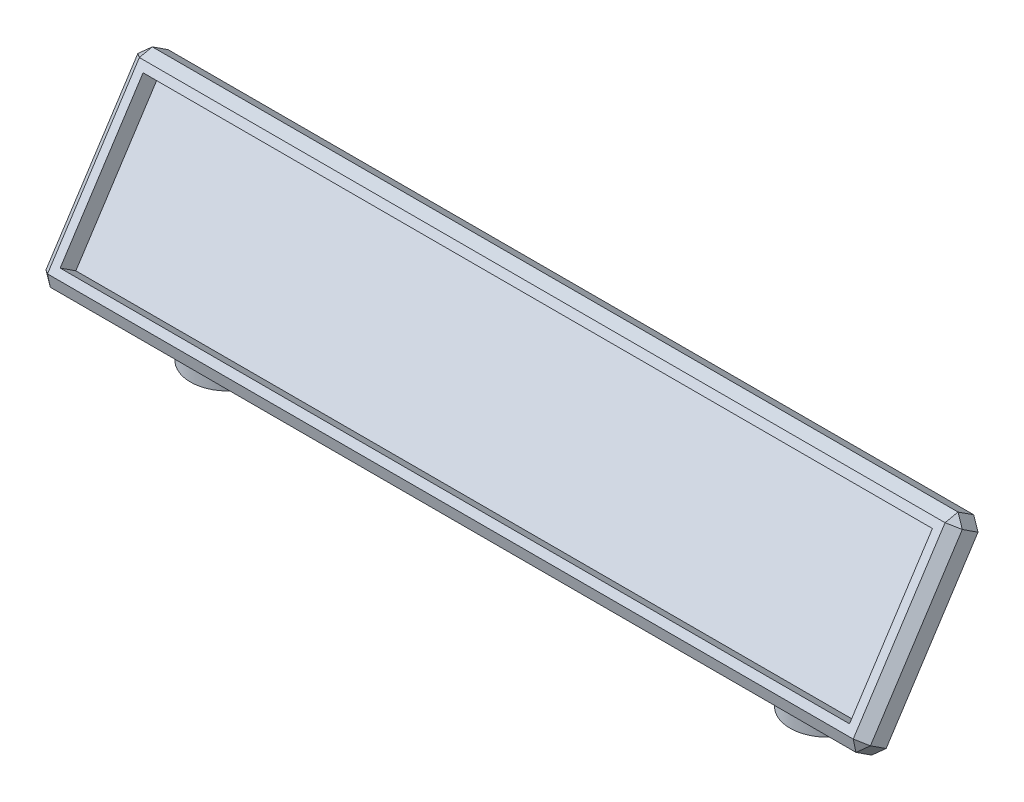
ISO-10303-21;
HEADER;
FILE_DESCRIPTION(('STEP AP214'),'2;1');
FILE_NAME('part.step','',(''),(''),'','','');
FILE_SCHEMA(('AUTOMOTIVE_DESIGN { 1 0 10303 214 1 1 1 1 }'));
ENDSEC;
DATA;
#1=APPLICATION_CONTEXT('core data for automotive mechanical design processes');
#2=APPLICATION_PROTOCOL_DEFINITION('international standard','automotive_design',2000,#1);
#3=PRODUCT_CONTEXT('',#1,'mechanical');
#4=PRODUCT('Part','Part','',(#3));
#5=PRODUCT_RELATED_PRODUCT_CATEGORY('part','',(#4));
#6=PRODUCT_DEFINITION_FORMATION('','',#4);
#7=PRODUCT_DEFINITION_CONTEXT('part definition',#1,'design');
#8=PRODUCT_DEFINITION('design','',#6,#7);
#9=PRODUCT_DEFINITION_SHAPE('','',#8);
#10=(LENGTH_UNIT() NAMED_UNIT(*) SI_UNIT(.MILLI.,.METRE.));
#11=(NAMED_UNIT(*) PLANE_ANGLE_UNIT() SI_UNIT($,.RADIAN.));
#12=(NAMED_UNIT(*) SI_UNIT($,.STERADIAN.) SOLID_ANGLE_UNIT());
#13=UNCERTAINTY_MEASURE_WITH_UNIT(LENGTH_MEASURE(1.E-05),#10,'distance_accuracy_value','');
#14=(GEOMETRIC_REPRESENTATION_CONTEXT(3) GLOBAL_UNCERTAINTY_ASSIGNED_CONTEXT((#13)) GLOBAL_UNIT_ASSIGNED_CONTEXT((#10,
#11,#12)) REPRESENTATION_CONTEXT('',''));
#15=CARTESIAN_POINT('',(0.,0.,0.));
#16=DIRECTION('',(0.,0.,1.));
#17=DIRECTION('',(1.,0.,0.));
#18=AXIS2_PLACEMENT_3D('',#15,#16,#17);
#19=CARTESIAN_POINT('',(0.,5.65083347470303,8.70152048404579));
#20=DIRECTION('',(0.,0.544639035015028,0.838670567945423));
#21=DIRECTION('',(0.,-0.838670567945423,0.544639035015028));
#22=AXIS2_PLACEMENT_3D('',#19,#20,#21);
#23=PLANE('',#22);
#24=DIRECTION('',(-1.,0.,0.));
#25=VECTOR('',#24,1.);
#26=CARTESIAN_POINT('',(-69.85,7.06749426047978,7.78153021277722));
#27=LINE('',#26,#25);
#28=CARTESIAN_POINT('',(68.2625,7.06749426047977,7.78153021277721));
#29=VERTEX_POINT('',#28);
#30=CARTESIAN_POINT('',(-68.2625,7.06749426047978,7.78153021277722));
#31=VERTEX_POINT('',#30);
#32=EDGE_CURVE('E252',#29,#31,#27,.T.);
#33=ORIENTED_EDGE('',*,*,#32,.T.);
#34=DIRECTION('',(0.,0.838670567945423,-0.544639035015028));
#35=VECTOR('',#34,1.);
#36=CARTESIAN_POINT('',(-68.2625,5.65083347470303,8.70152048404579));
#37=LINE('',#36,#35);
#38=CARTESIAN_POINT('',(-68.2625,31.0325057395202,-7.7815302127772));
#39=VERTEX_POINT('',#38);
#40=EDGE_CURVE('E261',#31,#39,#37,.T.);
#41=ORIENTED_EDGE('',*,*,#40,.T.);
#42=DIRECTION('',(1.,0.,0.));
#43=VECTOR('',#42,1.);
#44=CARTESIAN_POINT('',(0.,31.0325057395202,-7.7815302127772));
#45=LINE('',#44,#43);
#46=CARTESIAN_POINT('',(68.2625,31.0325057395202,-7.78153021277721));
#47=VERTEX_POINT('',#46);
#48=EDGE_CURVE('E258',#39,#47,#45,.T.);
#49=ORIENTED_EDGE('',*,*,#48,.T.);
#50=DIRECTION('',(0.,-0.838670567945423,0.544639035015028));
#51=VECTOR('',#50,1.);
#52=CARTESIAN_POINT('',(68.2625,5.73610473386639,8.64614468086358));
#53=LINE('',#52,#51);
#54=EDGE_CURVE('E255',#47,#29,#53,.T.);
#55=ORIENTED_EDGE('',*,*,#54,.T.);
#56=EDGE_LOOP('',(#33,#41,#49,#55));
#57=FACE_BOUND('',#56,.T.);
#58=CARTESIAN_POINT('',(-50.8,19.05,0.));
#59=DIRECTION('',(0.,0.544639035015028,0.838670567945423));
#60=DIRECTION('',(0.,-0.838670567945423,0.544639035015028));
#61=AXIS2_PLACEMENT_3D('',#58,#59,#60);
#62=ELLIPSE('',#61,11.6590982132318,6.35);
#63=CARTESIAN_POINT('',(-50.8,9.27185747977741,6.35000000000002));
#64=VERTEX_POINT('',#63);
#65=EDGE_CURVE('E227',#64,#64,#62,.T.);
#66=ORIENTED_EDGE('',*,*,#65,.T.);
#67=EDGE_LOOP('',(#66));
#68=FACE_BOUND('',#67,.T.);
#69=CARTESIAN_POINT('',(50.8,19.05,0.));
#70=DIRECTION('',(0.,0.544639035015028,0.838670567945423));
#71=DIRECTION('',(0.,-0.838670567945423,0.544639035015028));
#72=AXIS2_PLACEMENT_3D('',#69,#70,#71);
#73=ELLIPSE('',#72,11.6590982132318,6.35);
#74=CARTESIAN_POINT('',(50.8,9.27185747977745,6.34999999999999));
#75=VERTEX_POINT('',#74);
#76=EDGE_CURVE('E235',#75,#75,#73,.F.);
#77=ORIENTED_EDGE('',*,*,#76,.F.);
#78=EDGE_LOOP('',(#77));
#79=FACE_BOUND('',#78,.T.);
#80=ADVANCED_FACE('F49',(#57,#68,#79),#23,.F.);
#81=CARTESIAN_POINT('',(-50.8,19.05,0.));
#82=DIRECTION('',(0.,-1.,0.));
#83=DIRECTION('',(0.,0.,-1.));
#84=AXIS2_PLACEMENT_3D('',#81,#82,#83);
#85=CYLINDRICAL_SURFACE('',#84,6.35);
#86=CARTESIAN_POINT('',(-50.8,0.,0.));
#87=DIRECTION('',(0.,1.,0.));
#88=DIRECTION('',(0.,0.,1.));
#89=AXIS2_PLACEMENT_3D('',#86,#87,#88);
#90=CIRCLE('',#89,6.35);
#91=CARTESIAN_POINT('',(-50.8,0.,6.35000000000002));
#92=VERTEX_POINT('',#91);
#93=EDGE_CURVE('E231',#92,#92,#90,.T.);
#94=ORIENTED_EDGE('',*,*,#93,.T.);
#95=EDGE_LOOP('',(#94));
#96=FACE_BOUND('',#95,.T.);
#97=ORIENTED_EDGE('',*,*,#65,.F.);
#98=EDGE_LOOP('',(#97));
#99=FACE_BOUND('',#98,.T.);
#100=ADVANCED_FACE('F454',(#96,#99),#85,.T.);
#101=CARTESIAN_POINT('',(-50.8,0.,0.));
#102=DIRECTION('',(0.,1.,0.));
#103=DIRECTION('',(0.,0.,1.));
#104=AXIS2_PLACEMENT_3D('',#101,#102,#103);
#105=PLANE('',#104);
#106=CARTESIAN_POINT('',(-50.8,0.,0.));
#107=DIRECTION('',(0.,-1.,0.));
#108=DIRECTION('',(0.,0.,-1.));
#109=AXIS2_PLACEMENT_3D('',#106,#107,#108);
#110=CIRCLE('',#109,3.30200000000001);
#111=CARTESIAN_POINT('',(-50.8,0.,-3.302));
#112=VERTEX_POINT('',#111);
#113=EDGE_CURVE('E1039',#112,#112,#110,.T.);
#114=ORIENTED_EDGE('',*,*,#113,.F.);
#115=EDGE_LOOP('',(#114));
#116=FACE_BOUND('',#115,.T.);
#117=ORIENTED_EDGE('',*,*,#93,.F.);
#118=EDGE_LOOP('',(#117));
#119=FACE_BOUND('',#118,.T.);
#120=ADVANCED_FACE('F460',(#116,#119),#105,.F.);
#121=CARTESIAN_POINT('',(0.,35.822353138479,-3.32058657441013));
#122=DIRECTION('',(0.,-0.838670567945423,0.544639035015028));
#123=DIRECTION('',(0.,-0.544639035015028,-0.838670567945423));
#124=AXIS2_PLACEMENT_3D('',#121,#122,#123);
#125=PLANE('',#124);
#126=DIRECTION('',(0.,-0.544639035015028,-0.838670567945423));
#127=VECTOR('',#126,1.);
#128=CARTESIAN_POINT('',(68.2625,32.3638952661336,-8.64614468086357));
#129=LINE('',#128,#127);
#130=CARTESIAN_POINT('',(68.2625,34.9577386703927,-4.65197610102351));
#131=VERTEX_POINT('',#130);
#132=CARTESIAN_POINT('',(68.2625,33.22850973422,-7.31475515425019));
#133=VERTEX_POINT('',#132);
#134=EDGE_CURVE('E271',#131,#133,#129,.T.);
#135=ORIENTED_EDGE('',*,*,#134,.T.);
#136=DIRECTION('',(-1.,0.,0.));
#137=VECTOR('',#136,1.);
#138=CARTESIAN_POINT('',(0.,33.22850973422,-7.31475515425019));
#139=LINE('',#138,#137);
#140=CARTESIAN_POINT('',(-68.2625,33.22850973422,-7.31475515425018));
#141=VERTEX_POINT('',#140);
#142=EDGE_CURVE('E274',#133,#141,#139,.T.);
#143=ORIENTED_EDGE('',*,*,#142,.T.);
#144=DIRECTION('',(0.,0.544639035015028,0.838670567945423));
#145=VECTOR('',#144,1.);
#146=CARTESIAN_POINT('',(-68.2625,35.822353138479,-3.32058657441013));
#147=LINE('',#146,#145);
#148=CARTESIAN_POINT('',(-68.2625,34.9577386703927,-4.6519761010235));
#149=VERTEX_POINT('',#148);
#150=EDGE_CURVE('E265',#141,#149,#147,.T.);
#151=ORIENTED_EDGE('',*,*,#150,.T.);
#152=DIRECTION('',(1.,0.,0.));
#153=VECTOR('',#152,1.);
#154=CARTESIAN_POINT('',(69.85,34.9577386703927,-4.65197610102351));
#155=LINE('',#154,#153);
#156=EDGE_CURVE('E268',#149,#131,#155,.T.);
#157=ORIENTED_EDGE('',*,*,#156,.T.);
#158=EDGE_LOOP('',(#135,#143,#151,#157));
#159=FACE_BOUND('',#158,.T.);
#160=ADVANCED_FACE('F415',(#159),#125,.F.);
#161=CARTESIAN_POINT('',(-69.85,9.10929134704846,14.0270785904992));
#162=DIRECTION('',(1.,0.,0.));
#163=DIRECTION('',(0.,1.,0.));
#164=AXIS2_PLACEMENT_3D('',#161,#162,#163);
#165=PLANE('',#164);
#166=DIRECTION('',(0.,-0.544639035015028,-0.838670567945423));
#167=VECTOR('',#166,1.);
#168=CARTESIAN_POINT('',(-69.85,34.4909636118657,-2.45597210632377));
#169=LINE('',#168,#167);
#170=CARTESIAN_POINT('',(-69.85,33.6263491437793,-3.78736163293714));
#171=VERTEX_POINT('',#170);
#172=CARTESIAN_POINT('',(-69.85,31.8971202076066,-6.45014068616384));
#173=VERTEX_POINT('',#172);
#174=EDGE_CURVE('E239',#171,#173,#169,.T.);
#175=ORIENTED_EDGE('',*,*,#174,.T.);
#176=DIRECTION('',(0.,-0.838670567945423,0.544639035015028));
#177=VECTOR('',#176,1.);
#178=CARTESIAN_POINT('',(-69.85,6.51544794278939,10.0329100106592));
#179=LINE('',#178,#177);
#180=CARTESIAN_POINT('',(-69.85,7.93210872856614,9.11291973939058));
#181=VERTEX_POINT('',#180);
#182=EDGE_CURVE('E248',#173,#181,#179,.T.);
#183=ORIENTED_EDGE('',*,*,#182,.T.);
#184=DIRECTION('',(0.,0.544639035015028,0.838670567945423));
#185=VECTOR('',#184,1.);
#186=CARTESIAN_POINT('',(-69.85,10.5259521328252,13.1070883192307));
#187=LINE('',#186,#185);
#188=CARTESIAN_POINT('',(-69.85,9.66133766473884,11.7756987926173));
#189=VERTEX_POINT('',#188);
#190=EDGE_CURVE('E245',#181,#189,#187,.T.);
#191=ORIENTED_EDGE('',*,*,#190,.T.);
#192=DIRECTION('',(0.,0.838670567945423,-0.544639035015028));
#193=VECTOR('',#192,1.);
#194=CARTESIAN_POINT('',(-69.85,34.9577386703927,-4.65197610102349));
#195=LINE('',#194,#193);
#196=EDGE_CURVE('E242',#189,#171,#195,.T.);
#197=ORIENTED_EDGE('',*,*,#196,.T.);
#198=EDGE_LOOP('',(#175,#183,#191,#197));
#199=FACE_BOUND('',#198,.T.);
#200=ADVANCED_FACE('F473',(#199),#165,.F.);
#201=CARTESIAN_POINT('',(0.,9.19456260621184,13.971702787317));
#202=DIRECTION('',(0.,-0.838670567945423,0.544639035015028));
#203=DIRECTION('',(0.,-0.544639035015028,-0.838670567945423));
#204=AXIS2_PLACEMENT_3D('',#201,#202,#203);
#205=PLANE('',#204);
#206=DIRECTION('',(-1.,0.,0.));
#207=VECTOR('',#206,1.);
#208=CARTESIAN_POINT('',(0.,8.32994813812548,12.6403132607036));
#209=LINE('',#208,#207);
#210=CARTESIAN_POINT('',(68.2625,8.32994813812547,12.6403132607036));
#211=VERTEX_POINT('',#210);
#212=CARTESIAN_POINT('',(-68.2625,8.32994813812548,12.6403132607036));
#213=VERTEX_POINT('',#212);
#214=EDGE_CURVE('E294',#211,#213,#209,.T.);
#215=ORIENTED_EDGE('',*,*,#214,.T.);
#216=DIRECTION('',(0.,-0.544639035015028,-0.838670567945423));
#217=VECTOR('',#216,1.);
#218=CARTESIAN_POINT('',(-68.2625,5.73610473386641,8.64614468086358));
#219=LINE('',#218,#217);
#220=CARTESIAN_POINT('',(-68.2625,6.60071920195278,9.97753420747695));
#221=VERTEX_POINT('',#220);
#222=EDGE_CURVE('E301',#213,#221,#219,.T.);
#223=ORIENTED_EDGE('',*,*,#222,.T.);
#224=DIRECTION('',(1.,0.,0.));
#225=VECTOR('',#224,1.);
#226=CARTESIAN_POINT('',(69.85,6.60071920195278,9.97753420747695));
#227=LINE('',#226,#225);
#228=CARTESIAN_POINT('',(68.2625,6.60071920195278,9.97753420747695));
#229=VERTEX_POINT('',#228);
#230=EDGE_CURVE('E297',#221,#229,#227,.T.);
#231=ORIENTED_EDGE('',*,*,#230,.T.);
#232=DIRECTION('',(0.,0.544639035015028,0.838670567945423));
#233=VECTOR('',#232,1.);
#234=CARTESIAN_POINT('',(68.2625,9.19456260621184,13.971702787317));
#235=LINE('',#234,#233);
#236=EDGE_CURVE('E291',#229,#211,#235,.T.);
#237=ORIENTED_EDGE('',*,*,#236,.T.);
#238=EDGE_LOOP('',(#215,#223,#231,#237));
#239=FACE_BOUND('',#238,.T.);
#240=ADVANCED_FACE('F437',(#239),#205,.T.);
#241=CARTESIAN_POINT('',(69.85,9.10929134704845,14.0270785904992));
#242=DIRECTION('',(1.,0.,0.));
#243=DIRECTION('',(0.,1.,0.));
#244=AXIS2_PLACEMENT_3D('',#241,#242,#243);
#245=PLANE('',#244);
#246=DIRECTION('',(0.,-0.544639035015028,-0.838670567945423));
#247=VECTOR('',#246,1.);
#248=CARTESIAN_POINT('',(69.85,10.5259521328252,13.1070883192306));
#249=LINE('',#248,#247);
#250=CARTESIAN_POINT('',(69.85,9.66133766473884,11.7756987926173));
#251=VERTEX_POINT('',#250);
#252=CARTESIAN_POINT('',(69.85,7.93210872856614,9.11291973939058));
#253=VERTEX_POINT('',#252);
#254=EDGE_CURVE('E284',#251,#253,#249,.T.);
#255=ORIENTED_EDGE('',*,*,#254,.T.);
#256=DIRECTION('',(0.,0.838670567945423,-0.544639035015028));
#257=VECTOR('',#256,1.);
#258=CARTESIAN_POINT('',(69.85,33.22850973422,-7.31475515425019));
#259=LINE('',#258,#257);
#260=CARTESIAN_POINT('',(69.85,31.8971202076066,-6.45014068616383));
#261=VERTEX_POINT('',#260);
#262=EDGE_CURVE('E287',#253,#261,#259,.T.);
#263=ORIENTED_EDGE('',*,*,#262,.T.);
#264=DIRECTION('',(0.,0.544639035015028,0.838670567945423));
#265=VECTOR('',#264,1.);
#266=CARTESIAN_POINT('',(69.85,34.4909636118657,-2.45597210632377));
#267=LINE('',#266,#265);
#268=CARTESIAN_POINT('',(69.85,33.6263491437793,-3.78736163293714));
#269=VERTEX_POINT('',#268);
#270=EDGE_CURVE('E278',#261,#269,#267,.T.);
#271=ORIENTED_EDGE('',*,*,#270,.T.);
#272=DIRECTION('',(0.,-0.838670567945423,0.544639035015028));
#273=VECTOR('',#272,1.);
#274=CARTESIAN_POINT('',(69.85,8.24467687896209,12.6956890638859));
#275=LINE('',#274,#273);
#276=EDGE_CURVE('E281',#269,#251,#275,.T.);
#277=ORIENTED_EDGE('',*,*,#276,.T.);
#278=EDGE_LOOP('',(#255,#263,#271,#277));
#279=FACE_BOUND('',#278,.T.);
#280=ADVANCED_FACE('F467',(#279),#245,.T.);
#281=CARTESIAN_POINT('',(0.,9.10929134704845,14.0270785904992));
#282=DIRECTION('',(0.,0.544639035015028,0.838670567945423));
#283=DIRECTION('',(0.,-0.838670567945423,0.544639035015028));
#284=AXIS2_PLACEMENT_3D('',#281,#282,#283);
#285=PLANE('',#284);
#286=DIRECTION('',(0.,-0.838670567945423,0.544639035015028));
#287=VECTOR('',#286,1.);
#288=CARTESIAN_POINT('',(-68.2625,9.19456260621184,13.971702787317));
#289=LINE('',#288,#287);
#290=CARTESIAN_POINT('',(-68.2625,34.4909636118657,-2.45597210632377));
#291=VERTEX_POINT('',#290);
#292=CARTESIAN_POINT('',(-68.2625,10.5259521328252,13.1070883192306));
#293=VERTEX_POINT('',#292);
#294=EDGE_CURVE('E60',#291,#293,#289,.T.);
#295=ORIENTED_EDGE('',*,*,#294,.T.);
#296=DIRECTION('',(1.,0.,0.));
#297=VECTOR('',#296,1.);
#298=CARTESIAN_POINT('',(0.,10.5259521328252,13.1070883192306));
#299=LINE('',#298,#297);
#300=CARTESIAN_POINT('',(68.2625,10.5259521328252,13.1070883192306));
#301=VERTEX_POINT('',#300);
#302=EDGE_CURVE('E11',#293,#301,#299,.T.);
#303=ORIENTED_EDGE('',*,*,#302,.T.);
#304=DIRECTION('',(0.,0.838670567945423,-0.544639035015028));
#305=VECTOR('',#304,1.);
#306=CARTESIAN_POINT('',(68.2625,9.10929134704845,14.0270785904992));
#307=LINE('',#306,#305);
#308=CARTESIAN_POINT('',(68.2625,34.4909636118657,-2.45597210632377));
#309=VERTEX_POINT('',#308);
#310=EDGE_CURVE('E307',#301,#309,#307,.T.);
#311=ORIENTED_EDGE('',*,*,#310,.T.);
#312=DIRECTION('',(-1.,0.,0.));
#313=VECTOR('',#312,1.);
#314=CARTESIAN_POINT('',(-69.85,34.4909636118657,-2.45597210632376));
#315=LINE('',#314,#313);
#316=EDGE_CURVE('E304',#309,#291,#315,.T.);
#317=ORIENTED_EDGE('',*,*,#316,.T.);
#318=EDGE_LOOP('',(#295,#303,#311,#317));
#319=FACE_BOUND('',#318,.T.);
#320=DIRECTION('',(0.,0.838670567945423,-0.544639035015028));
#321=VECTOR('',#320,1.);
#322=CARTESIAN_POINT('',(66.875,11.6896075458495,12.3514016581473));
#323=LINE('',#322,#321);
#324=CARTESIAN_POINT('',(66.875,11.6896075458495,12.3514016581473));
#325=VERTEX_POINT('',#324);
#326=CARTESIAN_POINT('',(66.875,33.3273081988414,-1.70028544524043));
#327=VERTEX_POINT('',#326);
#328=EDGE_CURVE('E173',#325,#327,#323,.T.);
#329=ORIENTED_EDGE('',*,*,#328,.F.);
#330=DIRECTION('',(1.,0.,0.));
#331=VECTOR('',#330,1.);
#332=CARTESIAN_POINT('',(-66.875,11.6896075458495,12.3514016581473));
#333=LINE('',#332,#331);
#334=CARTESIAN_POINT('',(-66.875,11.6896075458495,12.3514016581473));
#335=VERTEX_POINT('',#334);
#336=EDGE_CURVE('E193',#335,#325,#333,.T.);
#337=ORIENTED_EDGE('',*,*,#336,.F.);
#338=DIRECTION('',(0.,-0.838670567945423,0.544639035015028));
#339=VECTOR('',#338,1.);
#340=CARTESIAN_POINT('',(-66.875,33.3273081988414,-1.70028544524042));
#341=LINE('',#340,#339);
#342=CARTESIAN_POINT('',(-66.875,33.3273081988414,-1.70028544524042));
#343=VERTEX_POINT('',#342);
#344=EDGE_CURVE('E197',#343,#335,#341,.T.);
#345=ORIENTED_EDGE('',*,*,#344,.F.);
#346=DIRECTION('',(-1.,0.,0.));
#347=VECTOR('',#346,1.);
#348=CARTESIAN_POINT('',(66.875,33.3273081988414,-1.70028544524042));
#349=LINE('',#348,#347);
#350=EDGE_CURVE('E209',#327,#343,#349,.T.);
#351=ORIENTED_EDGE('',*,*,#350,.F.);
#352=EDGE_LOOP('',(#329,#337,#345,#351));
#353=FACE_BOUND('',#352,.T.);
#354=ADVANCED_FACE('F422',(#319,#353),#285,.T.);
#355=CARTESIAN_POINT('',(50.8,19.05,0.));
#356=DIRECTION('',(0.,-1.,0.));
#357=DIRECTION('',(0.,0.,-1.));
#358=AXIS2_PLACEMENT_3D('',#355,#356,#357);
#359=CYLINDRICAL_SURFACE('',#358,6.35);
#360=CARTESIAN_POINT('',(50.8,0.,0.));
#361=DIRECTION('',(0.,1.,0.));
#362=DIRECTION('',(0.,0.,1.));
#363=AXIS2_PLACEMENT_3D('',#360,#361,#362);
#364=CIRCLE('',#363,6.35);
#365=CARTESIAN_POINT('',(50.8,0.,6.34999999999999));
#366=VERTEX_POINT('',#365);
#367=EDGE_CURVE('E218',#366,#366,#364,.T.);
#368=ORIENTED_EDGE('',*,*,#367,.T.);
#369=EDGE_LOOP('',(#368));
#370=FACE_BOUND('',#369,.T.);
#371=ORIENTED_EDGE('',*,*,#76,.T.);
#372=EDGE_LOOP('',(#371));
#373=FACE_BOUND('',#372,.T.);
#374=ADVANCED_FACE('F906',(#370,#373),#359,.T.);
#375=CARTESIAN_POINT('',(50.8,0.,0.));
#376=DIRECTION('',(0.,1.,0.));
#377=DIRECTION('',(0.,0.,1.));
#378=AXIS2_PLACEMENT_3D('',#375,#376,#377);
#379=PLANE('',#378);
#380=CARTESIAN_POINT('',(50.8,0.,0.));
#381=DIRECTION('',(0.,-1.,0.));
#382=DIRECTION('',(0.,0.,-1.));
#383=AXIS2_PLACEMENT_3D('',#380,#381,#382);
#384=CIRCLE('',#383,3.30200000000001);
#385=CARTESIAN_POINT('',(50.8,0.,-3.30200000000003));
#386=VERTEX_POINT('',#385);
#387=EDGE_CURVE('E1004',#386,#386,#384,.T.);
#388=ORIENTED_EDGE('',*,*,#387,.F.);
#389=EDGE_LOOP('',(#388));
#390=FACE_BOUND('',#389,.T.);
#391=ORIENTED_EDGE('',*,*,#367,.F.);
#392=EDGE_LOOP('',(#391));
#393=FACE_BOUND('',#392,.T.);
#394=ADVANCED_FACE('F900',(#390,#393),#379,.F.);
#395=CARTESIAN_POINT('',(66.875,9.96037860967674,9.6886226049206));
#396=DIRECTION('',(1.,0.,0.));
#397=DIRECTION('',(0.,0.,-1.));
#398=AXIS2_PLACEMENT_3D('',#395,#396,#397);
#399=PLANE('',#398);
#400=ORIENTED_EDGE('',*,*,#328,.T.);
#401=DIRECTION('',(0.,0.544639035015028,0.838670567945423));
#402=VECTOR('',#401,1.);
#403=CARTESIAN_POINT('',(66.875,31.5980792626687,-4.36306449846714));
#404=LINE('',#403,#402);
#405=CARTESIAN_POINT('',(66.875,31.5980792626687,-4.36306449846714));
#406=VERTEX_POINT('',#405);
#407=EDGE_CURVE('E166',#406,#327,#404,.T.);
#408=ORIENTED_EDGE('',*,*,#407,.F.);
#409=DIRECTION('',(0.,0.838670567945423,-0.544639035015028));
#410=VECTOR('',#409,1.);
#411=CARTESIAN_POINT('',(66.875,9.96037860967674,9.6886226049206));
#412=LINE('',#411,#410);
#413=CARTESIAN_POINT('',(66.875,9.96037860967674,9.6886226049206));
#414=VERTEX_POINT('',#413);
#415=EDGE_CURVE('E170',#414,#406,#412,.T.);
#416=ORIENTED_EDGE('',*,*,#415,.F.);
#417=DIRECTION('',(0.,0.544639035015028,0.838670567945423));
#418=VECTOR('',#417,1.);
#419=CARTESIAN_POINT('',(66.875,9.96037860967674,9.6886226049206));
#420=LINE('',#419,#418);
#421=EDGE_CURVE('E215',#414,#325,#420,.T.);
#422=ORIENTED_EDGE('',*,*,#421,.T.);
#423=EDGE_LOOP('',(#400,#408,#416,#422));
#424=FACE_BOUND('',#423,.T.);
#425=ADVANCED_FACE('F168',(#424),#399,.F.);
#426=CARTESIAN_POINT('',(-66.875,9.96037860967676,9.68862260492059));
#427=DIRECTION('',(0.,-0.838670567945423,0.544639035015028));
#428=DIRECTION('',(0.,-0.544639035015028,-0.838670567945423));
#429=AXIS2_PLACEMENT_3D('',#426,#427,#428);
#430=PLANE('',#429);
#431=ORIENTED_EDGE('',*,*,#336,.T.);
#432=ORIENTED_EDGE('',*,*,#421,.F.);
#433=DIRECTION('',(1.,0.,0.));
#434=VECTOR('',#433,1.);
#435=CARTESIAN_POINT('',(-66.875,9.96037860967676,9.68862260492059));
#436=LINE('',#435,#434);
#437=CARTESIAN_POINT('',(-66.875,9.96037860967676,9.68862260492059));
#438=VERTEX_POINT('',#437);
#439=EDGE_CURVE('E179',#438,#414,#436,.T.);
#440=ORIENTED_EDGE('',*,*,#439,.F.);
#441=DIRECTION('',(0.,0.544639035015028,0.838670567945423));
#442=VECTOR('',#441,1.);
#443=CARTESIAN_POINT('',(-66.875,9.96037860967676,9.68862260492059));
#444=LINE('',#443,#442);
#445=EDGE_CURVE('E219',#438,#335,#444,.T.);
#446=ORIENTED_EDGE('',*,*,#445,.T.);
#447=EDGE_LOOP('',(#431,#432,#440,#446));
#448=FACE_BOUND('',#447,.T.);
#449=ADVANCED_FACE('F879',(#448),#430,.F.);
#450=CARTESIAN_POINT('',(-66.875,31.5980792626687,-4.36306449846714));
#451=DIRECTION('',(-1.,0.,0.));
#452=DIRECTION('',(0.,0.,1.));
#453=AXIS2_PLACEMENT_3D('',#450,#451,#452);
#454=PLANE('',#453);
#455=ORIENTED_EDGE('',*,*,#344,.T.);
#456=ORIENTED_EDGE('',*,*,#445,.F.);
#457=DIRECTION('',(0.,-0.838670567945423,0.544639035015028));
#458=VECTOR('',#457,1.);
#459=CARTESIAN_POINT('',(-66.875,31.5980792626687,-4.36306449846714));
#460=LINE('',#459,#458);
#461=CARTESIAN_POINT('',(-66.875,31.5980792626687,-4.36306449846714));
#462=VERTEX_POINT('',#461);
#463=EDGE_CURVE('E188',#462,#438,#460,.T.);
#464=ORIENTED_EDGE('',*,*,#463,.F.);
#465=DIRECTION('',(0.,0.544639035015028,0.838670567945423));
#466=VECTOR('',#465,1.);
#467=CARTESIAN_POINT('',(-66.875,31.5980792626687,-4.36306449846714));
#468=LINE('',#467,#466);
#469=EDGE_CURVE('E178',#462,#343,#468,.T.);
#470=ORIENTED_EDGE('',*,*,#469,.T.);
#471=EDGE_LOOP('',(#455,#456,#464,#470));
#472=FACE_BOUND('',#471,.T.);
#473=ADVANCED_FACE('F869',(#472),#454,.F.);
#474=CARTESIAN_POINT('',(66.875,31.5980792626687,-4.36306449846714));
#475=DIRECTION('',(0.,0.838670567945423,-0.544639035015028));
#476=DIRECTION('',(0.,0.544639035015028,0.838670567945423));
#477=AXIS2_PLACEMENT_3D('',#474,#475,#476);
#478=PLANE('',#477);
#479=ORIENTED_EDGE('',*,*,#350,.T.);
#480=ORIENTED_EDGE('',*,*,#469,.F.);
#481=DIRECTION('',(-1.,0.,0.));
#482=VECTOR('',#481,1.);
#483=CARTESIAN_POINT('',(66.875,31.5980792626687,-4.36306449846714));
#484=LINE('',#483,#482);
#485=EDGE_CURVE('E182',#406,#462,#484,.T.);
#486=ORIENTED_EDGE('',*,*,#485,.F.);
#487=ORIENTED_EDGE('',*,*,#407,.T.);
#488=EDGE_LOOP('',(#479,#480,#486,#487));
#489=FACE_BOUND('',#488,.T.);
#490=ADVANCED_FACE('F183',(#489),#478,.F.);
#491=CARTESIAN_POINT('',(0.,7.38006241087575,11.3642995372725));
#492=DIRECTION('',(0.,0.544639035015028,0.838670567945423));
#493=DIRECTION('',(0.,-0.838670567945423,0.544639035015028));
#494=AXIS2_PLACEMENT_3D('',#491,#492,#493);
#495=PLANE('',#494);
#496=ORIENTED_EDGE('',*,*,#415,.T.);
#497=ORIENTED_EDGE('',*,*,#485,.T.);
#498=ORIENTED_EDGE('',*,*,#463,.T.);
#499=ORIENTED_EDGE('',*,*,#439,.T.);
#500=EDGE_LOOP('',(#496,#497,#498,#499));
#501=FACE_BOUND('',#500,.T.);
#502=ADVANCED_FACE('F190',(#501),#495,.T.);
#503=CARTESIAN_POINT('',(69.85,8.24467687896209,12.6956890638859));
#504=DIRECTION('',(-0.707106781186546,-0.385117954958025,-0.593029645775783));
#505=DIRECTION('',(0.,-0.838670567945423,0.544639035015028));
#506=AXIS2_PLACEMENT_3D('',#503,#504,#505);
#507=PLANE('',#506);
#508=DIRECTION('',(-0.707106781186549,0.385117954958026,0.593029645775779));
#509=VECTOR('',#508,1.);
#510=CARTESIAN_POINT('',(68.2625,34.4909636118657,-2.45597210632377));
#511=LINE('',#510,#509);
#512=EDGE_CURVE('E54',#309,#269,#511,.F.);
#513=ORIENTED_EDGE('',*,*,#512,.F.);
#514=ORIENTED_EDGE('',*,*,#310,.F.);
#515=DIRECTION('',(0.707106781186549,-0.385117954958026,-0.593029645775778));
#516=VECTOR('',#515,1.);
#517=CARTESIAN_POINT('',(68.2625,10.5259521328252,13.1070883192306));
#518=LINE('',#517,#516);
#519=EDGE_CURVE('E392',#251,#301,#518,.F.);
#520=ORIENTED_EDGE('',*,*,#519,.F.);
#521=ORIENTED_EDGE('',*,*,#276,.F.);
#522=EDGE_LOOP('',(#513,#514,#520,#521));
#523=FACE_BOUND('',#522,.T.);
#524=ADVANCED_FACE('F52',(#523),#507,.F.);
#525=CARTESIAN_POINT('',(68.2625,34.4909636118657,-2.45597210632377));
#526=DIRECTION('',(0.577350269189624,0.798654171641813,0.169759184687599));
#527=DIRECTION('',(-0.810416906773853,0.585853597083009,0.));
#528=AXIS2_PLACEMENT_3D('',#525,#526,#527);
#529=PLANE('',#528);
#530=DIRECTION('',(0.,-0.207911690817754,0.978147600733807));
#531=VECTOR('',#530,1.);
#532=CARTESIAN_POINT('',(68.2625,34.4909636118657,-2.45597210632377));
#533=LINE('',#532,#531);
#534=EDGE_CURVE('E385',#309,#131,#533,.F.);
#535=ORIENTED_EDGE('',*,*,#534,.F.);
#536=ORIENTED_EDGE('',*,*,#512,.T.);
#537=DIRECTION('',(-0.707106781186551,0.59302964577578,-0.385117954958022));
#538=VECTOR('',#537,1.);
#539=CARTESIAN_POINT('',(69.05625,34.292043907086,-4.21966886698033));
#540=LINE('',#539,#538);
#541=EDGE_CURVE('E389',#131,#269,#540,.F.);
#542=ORIENTED_EDGE('',*,*,#541,.F.);
#543=EDGE_LOOP('',(#535,#536,#542));
#544=FACE_BOUND('',#543,.T.);
#545=ADVANCED_FACE('F404',(#544),#529,.T.);
#546=CARTESIAN_POINT('',(68.2625,10.5259521328252,13.1070883192306));
#547=DIRECTION('',(0.577350269189623,-0.1697591846876,0.798654171641814));
#548=DIRECTION('',(0.810416906773854,0.,-0.585853597083007));
#549=AXIS2_PLACEMENT_3D('',#546,#547,#548);
#550=PLANE('',#549);
#551=DIRECTION('',(-0.707106781186549,-0.59302964577578,0.385117954958023));
#552=VECTOR('',#551,1.);
#553=CARTESIAN_POINT('',(69.05625,8.99564290143215,12.2080060266605));
#554=LINE('',#553,#552);
#555=EDGE_CURVE('E379',#251,#211,#554,.T.);
#556=ORIENTED_EDGE('',*,*,#555,.F.);
#557=ORIENTED_EDGE('',*,*,#519,.T.);
#558=DIRECTION('',(0.,0.978147600733806,0.207911690817755));
#559=VECTOR('',#558,1.);
#560=CARTESIAN_POINT('',(68.2625,10.5259521328252,13.1070883192306));
#561=LINE('',#560,#559);
#562=EDGE_CURVE('E73',#211,#301,#561,.T.);
#563=ORIENTED_EDGE('',*,*,#562,.F.);
#564=EDGE_LOOP('',(#556,#557,#563));
#565=FACE_BOUND('',#564,.T.);
#566=ADVANCED_FACE('F444',(#565),#550,.T.);
#567=CARTESIAN_POINT('',(68.2625,35.822353138479,-3.32058657441013));
#568=DIRECTION('',(0.707106781186544,0.593029645775785,-0.385117954958026));
#569=DIRECTION('',(0.,0.544639035015028,0.838670567945423));
#570=AXIS2_PLACEMENT_3D('',#567,#568,#569);
#571=PLANE('',#570);
#572=ORIENTED_EDGE('',*,*,#541,.T.);
#573=ORIENTED_EDGE('',*,*,#270,.F.);
#574=DIRECTION('',(0.707106781186551,-0.59302964577578,0.385117954958022));
#575=VECTOR('',#574,1.);
#576=CARTESIAN_POINT('',(69.05625,32.5628149709133,-6.88244792020701));
#577=LINE('',#576,#575);
#578=EDGE_CURVE('E372',#133,#261,#577,.T.);
#579=ORIENTED_EDGE('',*,*,#578,.F.);
#580=ORIENTED_EDGE('',*,*,#134,.F.);
#581=EDGE_LOOP('',(#572,#573,#579,#580));
#582=FACE_BOUND('',#581,.T.);
#583=ADVANCED_FACE('F411',(#582),#571,.T.);
#584=CARTESIAN_POINT('',(0.,34.4909636118657,-2.45597210632377));
#585=DIRECTION('',(0.,0.978147600733807,0.207911690817754));
#586=DIRECTION('',(1.,0.,0.));
#587=AXIS2_PLACEMENT_3D('',#584,#585,#586);
#588=PLANE('',#587);
#589=ORIENTED_EDGE('',*,*,#534,.T.);
#590=ORIENTED_EDGE('',*,*,#156,.F.);
#591=DIRECTION('',(0.,0.207911690817754,-0.978147600733807));
#592=VECTOR('',#591,1.);
#593=CARTESIAN_POINT('',(-68.2625,34.7243511411292,-3.55397410367364));
#594=LINE('',#593,#592);
#595=EDGE_CURVE('E368',#291,#149,#594,.T.);
#596=ORIENTED_EDGE('',*,*,#595,.F.);
#597=ORIENTED_EDGE('',*,*,#316,.F.);
#598=EDGE_LOOP('',(#589,#590,#596,#597));
#599=FACE_BOUND('',#598,.T.);
#600=ADVANCED_FACE('F421',(#599),#588,.T.);
#601=CARTESIAN_POINT('',(-68.2625,9.10929134704846,14.0270785904992));
#602=DIRECTION('',(-0.707106781186546,0.385117954958025,0.593029645775783));
#603=DIRECTION('',(0.,0.838670567945423,-0.544639035015028));
#604=AXIS2_PLACEMENT_3D('',#601,#602,#603);
#605=PLANE('',#604);
#606=DIRECTION('',(-0.707106781186549,-0.385117954958025,-0.593029645775779));
#607=VECTOR('',#606,1.);
#608=CARTESIAN_POINT('',(-69.05625,10.093644898782,12.441393555924));
#609=LINE('',#608,#607);
#610=EDGE_CURVE('E360',#293,#189,#609,.T.);
#611=ORIENTED_EDGE('',*,*,#610,.F.);
#612=ORIENTED_EDGE('',*,*,#294,.F.);
#613=DIRECTION('',(0.707106781186549,0.385117954958022,0.593029645775781));
#614=VECTOR('',#613,1.);
#615=CARTESIAN_POINT('',(-69.85,33.6263491437793,-3.78736163293714));
#616=LINE('',#615,#614);
#617=EDGE_CURVE('E364',#171,#291,#616,.T.);
#618=ORIENTED_EDGE('',*,*,#617,.F.);
#619=ORIENTED_EDGE('',*,*,#196,.F.);
#620=EDGE_LOOP('',(#611,#612,#618,#619));
#621=FACE_BOUND('',#620,.T.);
#622=ADVANCED_FACE('F427',(#621),#605,.T.);
#623=CARTESIAN_POINT('',(0.,8.32994813812547,12.6403132607036));
#624=DIRECTION('',(0.,0.207911690817755,-0.978147600733807));
#625=DIRECTION('',(-1.,0.,0.));
#626=AXIS2_PLACEMENT_3D('',#623,#624,#625);
#627=PLANE('',#626);
#628=ORIENTED_EDGE('',*,*,#562,.T.);
#629=ORIENTED_EDGE('',*,*,#302,.F.);
#630=DIRECTION('',(0.,-0.978147600733807,-0.207911690817755));
#631=VECTOR('',#630,1.);
#632=CARTESIAN_POINT('',(-68.2625,8.32994813812548,12.6403132607036));
#633=LINE('',#632,#631);
#634=EDGE_CURVE('E356',#213,#293,#633,.F.);
#635=ORIENTED_EDGE('',*,*,#634,.F.);
#636=ORIENTED_EDGE('',*,*,#214,.F.);
#637=EDGE_LOOP('',(#628,#629,#635,#636));
#638=FACE_BOUND('',#637,.T.);
#639=ADVANCED_FACE('F435',(#638),#627,.F.);
#640=CARTESIAN_POINT('',(69.85,10.5259521328252,13.1070883192306));
#641=DIRECTION('',(-0.707106781186546,0.593029645775784,-0.385117954958025));
#642=DIRECTION('',(0.,-0.544639035015028,-0.838670567945423));
#643=AXIS2_PLACEMENT_3D('',#640,#641,#642);
#644=PLANE('',#643);
#645=ORIENTED_EDGE('',*,*,#555,.T.);
#646=ORIENTED_EDGE('',*,*,#236,.F.);
#647=DIRECTION('',(0.707106781186549,0.59302964577578,-0.385117954958023));
#648=VECTOR('',#647,1.);
#649=CARTESIAN_POINT('',(69.05625,7.26641396525946,9.54522697343377));
#650=LINE('',#649,#648);
#651=EDGE_CURVE('E352',#253,#229,#650,.F.);
#652=ORIENTED_EDGE('',*,*,#651,.F.);
#653=ORIENTED_EDGE('',*,*,#254,.F.);
#654=EDGE_LOOP('',(#645,#646,#652,#653));
#655=FACE_BOUND('',#654,.T.);
#656=ADVANCED_FACE('F443',(#655),#644,.F.);
#657=CARTESIAN_POINT('',(68.2625,5.65083347470302,8.70152048404578));
#658=DIRECTION('',(0.707106781186551,-0.385117954958022,-0.593029645775779));
#659=DIRECTION('',(0.,0.838670567945423,-0.544639035015028));
#660=AXIS2_PLACEMENT_3D('',#657,#658,#659);
#661=PLANE('',#660);
#662=DIRECTION('',(-0.707106781186544,-0.385117954958028,-0.593029645775784));
#663=VECTOR('',#662,1.);
#664=CARTESIAN_POINT('',(68.2625,31.0325057395202,-7.78153021277721));
#665=LINE('',#664,#663);
#666=EDGE_CURVE('E375',#261,#47,#665,.T.);
#667=ORIENTED_EDGE('',*,*,#666,.F.);
#668=ORIENTED_EDGE('',*,*,#262,.F.);
#669=DIRECTION('',(0.707106781186544,0.385117954958026,0.593029645775785));
#670=VECTOR('',#669,1.);
#671=CARTESIAN_POINT('',(68.2625,7.06749426047977,7.78153021277721));
#672=LINE('',#671,#670);
#673=EDGE_CURVE('E348',#29,#253,#672,.T.);
#674=ORIENTED_EDGE('',*,*,#673,.F.);
#675=ORIENTED_EDGE('',*,*,#54,.F.);
#676=EDGE_LOOP('',(#667,#668,#674,#675));
#677=FACE_BOUND('',#676,.T.);
#678=ADVANCED_FACE('F558',(#677),#661,.T.);
#679=CARTESIAN_POINT('',(68.2625,31.0325057395202,-7.78153021277721));
#680=DIRECTION('',(0.577350269189625,0.169759184687609,-0.79865417164181));
#681=DIRECTION('',(-0.810416906773852,0.,-0.585853597083011));
#682=AXIS2_PLACEMENT_3D('',#679,#680,#681);
#683=PLANE('',#682);
#684=ORIENTED_EDGE('',*,*,#578,.T.);
#685=ORIENTED_EDGE('',*,*,#666,.T.);
#686=DIRECTION('',(0.,-0.978147600733805,-0.207911690817762));
#687=VECTOR('',#686,1.);
#688=CARTESIAN_POINT('',(68.2625,31.0325057395202,-7.78153021277721));
#689=LINE('',#688,#687);
#690=EDGE_CURVE('E344',#133,#47,#689,.T.);
#691=ORIENTED_EDGE('',*,*,#690,.F.);
#692=EDGE_LOOP('',(#684,#685,#691));
#693=FACE_BOUND('',#692,.T.);
#694=ADVANCED_FACE('F551',(#693),#683,.T.);
#695=CARTESIAN_POINT('',(-69.85,33.6263491437793,-3.78736163293714));
#696=DIRECTION('',(-0.577350269189622,0.798654171641814,0.1697591846876));
#697=DIRECTION('',(-0.810416906773855,-0.585853597083006,0.));
#698=AXIS2_PLACEMENT_3D('',#695,#696,#697);
#699=PLANE('',#698);
#700=ORIENTED_EDGE('',*,*,#617,.T.);
#701=ORIENTED_EDGE('',*,*,#595,.T.);
#702=DIRECTION('',(0.707106781186551,0.593029645775778,-0.385117954958024));
#703=VECTOR('',#702,1.);
#704=CARTESIAN_POINT('',(-69.85,33.6263491437793,-3.78736163293714));
#705=LINE('',#704,#703);
#706=EDGE_CURVE('E340',#171,#149,#705,.T.);
#707=ORIENTED_EDGE('',*,*,#706,.F.);
#708=EDGE_LOOP('',(#700,#701,#707));
#709=FACE_BOUND('',#708,.T.);
#710=ADVANCED_FACE('F545',(#709),#699,.T.);
#711=CARTESIAN_POINT('',(-68.2625,8.32994813812548,12.6403132607036));
#712=DIRECTION('',(-0.577350269189624,-0.1697591846876,0.798654171641813));
#713=DIRECTION('',(0.810416906773853,0.,0.585853597083008));
#714=AXIS2_PLACEMENT_3D('',#711,#712,#713);
#715=PLANE('',#714);
#716=ORIENTED_EDGE('',*,*,#634,.T.);
#717=ORIENTED_EDGE('',*,*,#610,.T.);
#718=DIRECTION('',(0.707106781186549,-0.59302964577578,0.385117954958024));
#719=VECTOR('',#718,1.);
#720=CARTESIAN_POINT('',(-68.2625,8.32994813812548,12.6403132607036));
#721=LINE('',#720,#719);
#722=EDGE_CURVE('E336',#213,#189,#721,.F.);
#723=ORIENTED_EDGE('',*,*,#722,.F.);
#724=EDGE_LOOP('',(#716,#717,#723));
#725=FACE_BOUND('',#724,.T.);
#726=ADVANCED_FACE('F433',(#725),#715,.T.);
#727=CARTESIAN_POINT('',(68.2625,7.06749426047977,7.78153021277721));
#728=DIRECTION('',(0.577350269189627,-0.798654171641812,-0.169759184687595));
#729=DIRECTION('',(0.810416906773851,0.585853597083011,0.));
#730=AXIS2_PLACEMENT_3D('',#727,#728,#729);
#731=PLANE('',#730);
#732=ORIENTED_EDGE('',*,*,#673,.T.);
#733=ORIENTED_EDGE('',*,*,#651,.T.);
#734=DIRECTION('',(0.,0.207911690817755,-0.978147600733807));
#735=VECTOR('',#734,1.);
#736=CARTESIAN_POINT('',(68.2625,7.06749426047977,7.78153021277721));
#737=LINE('',#736,#735);
#738=EDGE_CURVE('E333',#29,#229,#737,.F.);
#739=ORIENTED_EDGE('',*,*,#738,.F.);
#740=EDGE_LOOP('',(#732,#733,#739));
#741=FACE_BOUND('',#740,.T.);
#742=ADVANCED_FACE('F532',(#741),#731,.T.);
#743=CARTESIAN_POINT('',(0.,33.22850973422,-7.31475515425019));
#744=DIRECTION('',(0.,-0.207911690817762,0.978147600733805));
#745=DIRECTION('',(-1.,0.,0.));
#746=AXIS2_PLACEMENT_3D('',#743,#744,#745);
#747=PLANE('',#746);
#748=ORIENTED_EDGE('',*,*,#690,.T.);
#749=ORIENTED_EDGE('',*,*,#48,.F.);
#750=DIRECTION('',(0.,0.978147600733805,0.207911690817762));
#751=VECTOR('',#750,1.);
#752=CARTESIAN_POINT('',(-68.2625,31.0325057395202,-7.7815302127772));
#753=LINE('',#752,#751);
#754=EDGE_CURVE('E329',#141,#39,#753,.F.);
#755=ORIENTED_EDGE('',*,*,#754,.F.);
#756=ORIENTED_EDGE('',*,*,#142,.F.);
#757=EDGE_LOOP('',(#748,#749,#755,#756));
#758=FACE_BOUND('',#757,.T.);
#759=ADVANCED_FACE('F525',(#758),#747,.F.);
#760=CARTESIAN_POINT('',(-69.85,34.4909636118657,-2.45597210632376));
#761=DIRECTION('',(0.707106781186544,-0.593029645775785,0.385117954958026));
#762=DIRECTION('',(0.,-0.544639035015028,-0.838670567945423));
#763=AXIS2_PLACEMENT_3D('',#760,#761,#762);
#764=PLANE('',#763);
#765=ORIENTED_EDGE('',*,*,#706,.T.);
#766=ORIENTED_EDGE('',*,*,#150,.F.);
#767=DIRECTION('',(-0.707106781186551,-0.593029645775782,0.385117954958017));
#768=VECTOR('',#767,1.);
#769=CARTESIAN_POINT('',(-69.05625,32.5628149709133,-6.88244792020701));
#770=LINE('',#769,#768);
#771=EDGE_CURVE('E326',#173,#141,#770,.F.);
#772=ORIENTED_EDGE('',*,*,#771,.F.);
#773=ORIENTED_EDGE('',*,*,#174,.F.);
#774=EDGE_LOOP('',(#765,#766,#772,#773));
#775=FACE_BOUND('',#774,.T.);
#776=ADVANCED_FACE('F518',(#775),#764,.F.);
#777=CARTESIAN_POINT('',(-68.2625,9.19456260621184,13.971702787317));
#778=DIRECTION('',(-0.707106781186546,-0.593029645775783,0.385117954958025));
#779=DIRECTION('',(0.,0.544639035015028,0.838670567945423));
#780=AXIS2_PLACEMENT_3D('',#777,#778,#779);
#781=PLANE('',#780);
#782=ORIENTED_EDGE('',*,*,#722,.T.);
#783=ORIENTED_EDGE('',*,*,#190,.F.);
#784=DIRECTION('',(-0.707106781186549,0.593029645775778,-0.385117954958028));
#785=VECTOR('',#784,1.);
#786=CARTESIAN_POINT('',(-69.85,7.93210872856614,9.11291973939058));
#787=LINE('',#786,#785);
#788=EDGE_CURVE('E322',#221,#181,#787,.T.);
#789=ORIENTED_EDGE('',*,*,#788,.F.);
#790=ORIENTED_EDGE('',*,*,#222,.F.);
#791=EDGE_LOOP('',(#782,#783,#789,#790));
#792=FACE_BOUND('',#791,.T.);
#793=ADVANCED_FACE('F511',(#792),#781,.T.);
#794=CARTESIAN_POINT('',(0.,7.06749426047978,7.78153021277721));
#795=DIRECTION('',(0.,-0.978147600733806,-0.207911690817755));
#796=DIRECTION('',(1.,0.,0.));
#797=AXIS2_PLACEMENT_3D('',#794,#795,#796);
#798=PLANE('',#797);
#799=ORIENTED_EDGE('',*,*,#738,.T.);
#800=ORIENTED_EDGE('',*,*,#230,.F.);
#801=DIRECTION('',(0.,-0.207911690817755,0.978147600733807));
#802=VECTOR('',#801,1.);
#803=CARTESIAN_POINT('',(-68.2625,6.83410673121628,8.87953221012708));
#804=LINE('',#803,#802);
#805=EDGE_CURVE('E318',#31,#221,#804,.T.);
#806=ORIENTED_EDGE('',*,*,#805,.F.);
#807=ORIENTED_EDGE('',*,*,#32,.F.);
#808=EDGE_LOOP('',(#799,#800,#806,#807));
#809=FACE_BOUND('',#808,.T.);
#810=ADVANCED_FACE('F504',(#809),#798,.T.);
#811=CARTESIAN_POINT('',(-68.2625,31.0325057395202,-7.7815302127772));
#812=DIRECTION('',(-0.577350269189621,0.169759184687606,-0.798654171641814));
#813=DIRECTION('',(-0.810416906773855,0.,0.585853597083006));
#814=AXIS2_PLACEMENT_3D('',#811,#812,#813);
#815=PLANE('',#814);
#816=ORIENTED_EDGE('',*,*,#771,.T.);
#817=ORIENTED_EDGE('',*,*,#754,.T.);
#818=DIRECTION('',(0.70710678118655,-0.385117954958024,-0.593029645775779));
#819=VECTOR('',#818,1.);
#820=CARTESIAN_POINT('',(-68.2625,31.0325057395202,-7.7815302127772));
#821=LINE('',#820,#819);
#822=EDGE_CURVE('E315',#173,#39,#821,.T.);
#823=ORIENTED_EDGE('',*,*,#822,.F.);
#824=EDGE_LOOP('',(#816,#817,#823));
#825=FACE_BOUND('',#824,.T.);
#826=ADVANCED_FACE('F497',(#825),#815,.T.);
#827=CARTESIAN_POINT('',(-69.85,7.93210872856614,9.11291973939058));
#828=DIRECTION('',(-0.577350269189622,-0.798654171641814,-0.1697591846876));
#829=DIRECTION('',(0.810416906773854,-0.585853597083007,0.));
#830=AXIS2_PLACEMENT_3D('',#827,#828,#829);
#831=PLANE('',#830);
#832=ORIENTED_EDGE('',*,*,#805,.T.);
#833=ORIENTED_EDGE('',*,*,#788,.T.);
#834=DIRECTION('',(-0.70710678118655,0.385117954958023,0.59302964577578));
#835=VECTOR('',#834,1.);
#836=CARTESIAN_POINT('',(-69.85,7.93210872856614,9.11291973939058));
#837=LINE('',#836,#835);
#838=EDGE_CURVE('E312',#31,#181,#837,.T.);
#839=ORIENTED_EDGE('',*,*,#838,.F.);
#840=EDGE_LOOP('',(#832,#833,#839));
#841=FACE_BOUND('',#840,.T.);
#842=ADVANCED_FACE('F490',(#841),#831,.T.);
#843=CARTESIAN_POINT('',(-69.85,6.51544794278939,10.0329100106592));
#844=DIRECTION('',(0.707106781186545,0.385117954958025,0.593029645775784));
#845=DIRECTION('',(0.,-0.838670567945423,0.544639035015028));
#846=AXIS2_PLACEMENT_3D('',#843,#844,#845);
#847=PLANE('',#846);
#848=ORIENTED_EDGE('',*,*,#822,.T.);
#849=ORIENTED_EDGE('',*,*,#40,.F.);
#850=ORIENTED_EDGE('',*,*,#838,.T.);
#851=ORIENTED_EDGE('',*,*,#182,.F.);
#852=EDGE_LOOP('',(#848,#849,#850,#851));
#853=FACE_BOUND('',#852,.T.);
#854=ADVANCED_FACE('F483',(#853),#847,.F.);
#855=CARTESIAN_POINT('',(50.8,12.7,0.));
#856=DIRECTION('',(0.,1.,0.));
#857=DIRECTION('',(0.,0.,1.));
#858=AXIS2_PLACEMENT_3D('',#855,#856,#857);
#859=PLANE('',#858);
#860=CARTESIAN_POINT('',(50.8,12.7,0.));
#861=DIRECTION('',(0.,-1.,0.));
#862=DIRECTION('',(0.,0.,-1.));
#863=AXIS2_PLACEMENT_3D('',#860,#861,#862);
#864=CIRCLE('',#863,2.85750000000001);
#865=CARTESIAN_POINT('',(50.8,12.7,-2.85750000000003));
#866=VERTEX_POINT('',#865);
#867=EDGE_CURVE('E200',#866,#866,#864,.T.);
#868=ORIENTED_EDGE('',*,*,#867,.T.);
#869=EDGE_LOOP('',(#868));
#870=FACE_BOUND('',#869,.T.);
#871=ADVANCED_FACE('F489',(#870),#859,.F.);
#872=CARTESIAN_POINT('',(50.8,0.,0.));
#873=DIRECTION('',(0.,-1.,0.));
#874=DIRECTION('',(0.,0.,-1.));
#875=AXIS2_PLACEMENT_3D('',#872,#873,#874);
#876=CYLINDRICAL_SURFACE('',#875,2.85750000000001);
#877=ORIENTED_EDGE('',*,*,#867,.F.);
#878=EDGE_LOOP('',(#877));
#879=FACE_BOUND('',#878,.T.);
#880=CARTESIAN_POINT('',(50.8,0.6858,0.));
#881=DIRECTION('',(0.,-1.,0.));
#882=DIRECTION('',(0.,0.,-1.));
#883=AXIS2_PLACEMENT_3D('',#880,#881,#882);
#884=CIRCLE('',#883,2.85750000000001);
#885=CARTESIAN_POINT('',(50.8,0.6858,-2.85750000000003));
#886=VERTEX_POINT('',#885);
#887=EDGE_CURVE('E1017',#886,#886,#884,.T.);
#888=ORIENTED_EDGE('',*,*,#887,.T.);
#889=EDGE_LOOP('',(#888));
#890=FACE_BOUND('',#889,.T.);
#891=ADVANCED_FACE('F665',(#879,#890),#876,.F.);
#892=CARTESIAN_POINT('',(53.6575,0.6858,0.));
#893=DIRECTION('',(0.,1.,0.));
#894=DIRECTION('',(0.,0.,1.));
#895=AXIS2_PLACEMENT_3D('',#892,#893,#894);
#896=PLANE('',#895);
#897=ORIENTED_EDGE('',*,*,#887,.F.);
#898=EDGE_LOOP('',(#897));
#899=FACE_BOUND('',#898,.T.);
#900=CARTESIAN_POINT('',(50.8,0.6858,0.));
#901=DIRECTION('',(0.,-1.,0.));
#902=DIRECTION('',(0.,0.,-1.));
#903=AXIS2_PLACEMENT_3D('',#900,#901,#902);
#904=CIRCLE('',#903,3.30200000000001);
#905=CARTESIAN_POINT('',(50.8,0.6858,-3.30200000000003));
#906=VERTEX_POINT('',#905);
#907=EDGE_CURVE('E1011',#906,#906,#904,.T.);
#908=ORIENTED_EDGE('',*,*,#907,.T.);
#909=EDGE_LOOP('',(#908));
#910=FACE_BOUND('',#909,.T.);
#911=ADVANCED_FACE('F674',(#899,#910),#896,.F.);
#912=CARTESIAN_POINT('',(50.8,0.,0.));
#913=DIRECTION('',(0.,-1.,0.));
#914=DIRECTION('',(0.,0.,-1.));
#915=AXIS2_PLACEMENT_3D('',#912,#913,#914);
#916=CYLINDRICAL_SURFACE('',#915,3.30200000000001);
#917=ORIENTED_EDGE('',*,*,#907,.F.);
#918=EDGE_LOOP('',(#917));
#919=FACE_BOUND('',#918,.T.);
#920=ORIENTED_EDGE('',*,*,#387,.T.);
#921=EDGE_LOOP('',(#920));
#922=FACE_BOUND('',#921,.T.);
#923=ADVANCED_FACE('F682',(#919,#922),#916,.F.);
#924=CARTESIAN_POINT('',(-50.8,12.7,0.));
#925=DIRECTION('',(0.,1.,0.));
#926=DIRECTION('',(0.,0.,1.));
#927=AXIS2_PLACEMENT_3D('',#924,#925,#926);
#928=PLANE('',#927);
#929=CARTESIAN_POINT('',(-50.8,12.7,0.));
#930=DIRECTION('',(0.,-1.,0.));
#931=DIRECTION('',(0.,0.,-1.));
#932=AXIS2_PLACEMENT_3D('',#929,#930,#931);
#933=CIRCLE('',#932,2.85750000000001);
#934=CARTESIAN_POINT('',(-50.8,12.7,-2.8575));
#935=VERTEX_POINT('',#934);
#936=EDGE_CURVE('E1012',#935,#935,#933,.T.);
#937=ORIENTED_EDGE('',*,*,#936,.T.);
#938=EDGE_LOOP('',(#937));
#939=FACE_BOUND('',#938,.T.);
#940=ADVANCED_FACE('F691',(#939),#928,.F.);
#941=CARTESIAN_POINT('',(-50.8,0.,0.));
#942=DIRECTION('',(0.,-1.,0.));
#943=DIRECTION('',(0.,0.,-1.));
#944=AXIS2_PLACEMENT_3D('',#941,#942,#943);
#945=CYLINDRICAL_SURFACE('',#944,2.85750000000001);
#946=ORIENTED_EDGE('',*,*,#936,.F.);
#947=EDGE_LOOP('',(#946));
#948=FACE_BOUND('',#947,.T.);
#949=CARTESIAN_POINT('',(-50.8,0.6858,0.));
#950=DIRECTION('',(0.,-1.,0.));
#951=DIRECTION('',(0.,0.,-1.));
#952=AXIS2_PLACEMENT_3D('',#949,#950,#951);
#953=CIRCLE('',#952,2.85750000000001);
#954=CARTESIAN_POINT('',(-50.8,0.6858,-2.8575));
#955=VERTEX_POINT('',#954);
#956=EDGE_CURVE('E1020',#955,#955,#953,.T.);
#957=ORIENTED_EDGE('',*,*,#956,.T.);
#958=EDGE_LOOP('',(#957));
#959=FACE_BOUND('',#958,.T.);
#960=ADVANCED_FACE('F699',(#948,#959),#945,.F.);
#961=CARTESIAN_POINT('',(-47.9425,0.6858,0.));
#962=DIRECTION('',(0.,1.,0.));
#963=DIRECTION('',(0.,0.,1.));
#964=AXIS2_PLACEMENT_3D('',#961,#962,#963);
#965=PLANE('',#964);
#966=ORIENTED_EDGE('',*,*,#956,.F.);
#967=EDGE_LOOP('',(#966));
#968=FACE_BOUND('',#967,.T.);
#969=CARTESIAN_POINT('',(-50.8,0.6858,0.));
#970=DIRECTION('',(0.,-1.,0.));
#971=DIRECTION('',(0.,0.,-1.));
#972=AXIS2_PLACEMENT_3D('',#969,#970,#971);
#973=CIRCLE('',#972,3.30200000000001);
#974=CARTESIAN_POINT('',(-50.8,0.6858,-3.302));
#975=VERTEX_POINT('',#974);
#976=EDGE_CURVE('E1035',#975,#975,#973,.T.);
#977=ORIENTED_EDGE('',*,*,#976,.T.);
#978=EDGE_LOOP('',(#977));
#979=FACE_BOUND('',#978,.T.);
#980=ADVANCED_FACE('F707',(#968,#979),#965,.F.);
#981=CARTESIAN_POINT('',(-50.8,0.,0.));
#982=DIRECTION('',(0.,-1.,0.));
#983=DIRECTION('',(0.,0.,-1.));
#984=AXIS2_PLACEMENT_3D('',#981,#982,#983);
#985=CYLINDRICAL_SURFACE('',#984,3.30200000000001);
#986=ORIENTED_EDGE('',*,*,#976,.F.);
#987=EDGE_LOOP('',(#986));
#988=FACE_BOUND('',#987,.T.);
#989=ORIENTED_EDGE('',*,*,#113,.T.);
#990=EDGE_LOOP('',(#989));
#991=FACE_BOUND('',#990,.T.);
#992=ADVANCED_FACE('F715',(#988,#991),#985,.F.);
#993=CLOSED_SHELL('',(#80,#100,#120,#160,#200,#240,#280,#354,#374,#394,#425,#449,#473,#490,#502,
#524,#545,#566,#583,#600,#622,#639,#656,#678,#694,#710,#726,#742,#759,#776,#793,#810,#826,#842,
#854,#871,#891,#911,#923,#940,#960,#980,#992));
#994=MANIFOLD_SOLID_BREP('B2',#993);
#995=ADVANCED_BREP_SHAPE_REPRESENTATION('',(#18,#994),#14);
#996=SHAPE_DEFINITION_REPRESENTATION(#9,#995);
ENDSEC;
END-ISO-10303-21;
